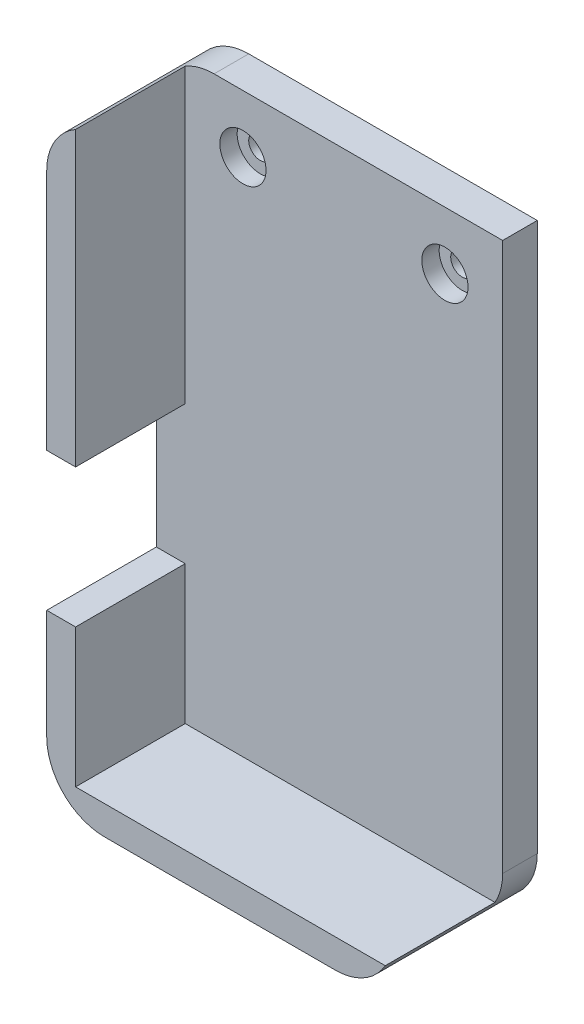
ISO-10303-21;
HEADER;
FILE_DESCRIPTION(('STEP AP214'),'2;1');
FILE_NAME('part.step','',(''),(''),'','','');
FILE_SCHEMA(('AUTOMOTIVE_DESIGN { 1 0 10303 214 1 1 1 1 }'));
ENDSEC;
DATA;
#1=APPLICATION_CONTEXT('core data for automotive mechanical design processes');
#2=APPLICATION_PROTOCOL_DEFINITION('international standard','automotive_design',2000,#1);
#3=PRODUCT_CONTEXT('',#1,'mechanical');
#4=PRODUCT('Part','Part','',(#3));
#5=PRODUCT_RELATED_PRODUCT_CATEGORY('part','',(#4));
#6=PRODUCT_DEFINITION_FORMATION('','',#4);
#7=PRODUCT_DEFINITION_CONTEXT('part definition',#1,'design');
#8=PRODUCT_DEFINITION('design','',#6,#7);
#9=PRODUCT_DEFINITION_SHAPE('','',#8);
#10=(LENGTH_UNIT() NAMED_UNIT(*) SI_UNIT(.MILLI.,.METRE.));
#11=(NAMED_UNIT(*) PLANE_ANGLE_UNIT() SI_UNIT($,.RADIAN.));
#12=(NAMED_UNIT(*) SI_UNIT($,.STERADIAN.) SOLID_ANGLE_UNIT());
#13=UNCERTAINTY_MEASURE_WITH_UNIT(LENGTH_MEASURE(1.E-05),#10,'distance_accuracy_value','');
#14=(GEOMETRIC_REPRESENTATION_CONTEXT(3) GLOBAL_UNCERTAINTY_ASSIGNED_CONTEXT((#13)) GLOBAL_UNIT_ASSIGNED_CONTEXT((#10,
#11,#12)) REPRESENTATION_CONTEXT('',''));
#15=CARTESIAN_POINT('',(0.,0.,0.));
#16=DIRECTION('',(0.,0.,1.));
#17=DIRECTION('',(1.,0.,0.));
#18=AXIS2_PLACEMENT_3D('',#15,#16,#17);
#19=CARTESIAN_POINT('',(5.,0.,25.));
#20=DIRECTION('',(1.,0.,0.));
#21=DIRECTION('',(0.,1.,0.));
#22=AXIS2_PLACEMENT_3D('',#19,#20,#21);
#23=PLANE('',#22);
#24=DIRECTION('',(0.,0.,1.));
#25=VECTOR('',#24,1.);
#26=CARTESIAN_POINT('',(4.99999999999999,53.,6.));
#27=LINE('',#26,#25);
#28=CARTESIAN_POINT('',(4.99999999999999,53.,6.));
#29=VERTEX_POINT('',#28);
#30=CARTESIAN_POINT('',(4.99999999999999,53.,25.));
#31=VERTEX_POINT('',#30);
#32=EDGE_CURVE('E162',#29,#31,#27,.T.);
#33=ORIENTED_EDGE('',*,*,#32,.F.);
#34=DIRECTION('',(0.,1.,0.));
#35=VECTOR('',#34,1.);
#36=CARTESIAN_POINT('',(5.,0.,6.));
#37=LINE('',#36,#35);
#38=CARTESIAN_POINT('',(4.99999999999999,103.660254037844,6.));
#39=VERTEX_POINT('',#38);
#40=EDGE_CURVE('E61',#29,#39,#37,.T.);
#41=ORIENTED_EDGE('',*,*,#40,.T.);
#42=DIRECTION('',(0.,0.,-1.));
#43=VECTOR('',#42,1.);
#44=CARTESIAN_POINT('',(4.99999999999999,103.660254037844,6.));
#45=LINE('',#44,#43);
#46=CARTESIAN_POINT('',(4.99999999999999,103.660254037844,25.));
#47=VERTEX_POINT('',#46);
#48=EDGE_CURVE('E11',#39,#47,#45,.F.);
#49=ORIENTED_EDGE('',*,*,#48,.T.);
#50=DIRECTION('',(0.,-1.,0.));
#51=VECTOR('',#50,1.);
#52=CARTESIAN_POINT('',(5.,0.,25.));
#53=LINE('',#52,#51);
#54=EDGE_CURVE('E190',#47,#31,#53,.T.);
#55=ORIENTED_EDGE('',*,*,#54,.T.);
#56=EDGE_LOOP('',(#33,#41,#49,#55));
#57=FACE_BOUND('',#56,.T.);
#58=ADVANCED_FACE('F39',(#57),#23,.T.);
#59=CARTESIAN_POINT('',(0.,0.,25.));
#60=DIRECTION('',(0.,0.,1.));
#61=DIRECTION('',(1.,0.,0.));
#62=AXIS2_PLACEMENT_3D('',#59,#60,#61);
#63=PLANE('',#62);
#64=DIRECTION('',(-1.,0.,0.));
#65=VECTOR('',#64,1.);
#66=CARTESIAN_POINT('',(0.,53.,25.));
#67=LINE('',#66,#65);
#68=CARTESIAN_POINT('',(0.,53.,25.));
#69=VERTEX_POINT('',#68);
#70=EDGE_CURVE('E155',#31,#69,#67,.T.);
#71=ORIENTED_EDGE('',*,*,#70,.F.);
#72=ORIENTED_EDGE('',*,*,#54,.F.);
#73=CARTESIAN_POINT('',(10.,95.,25.));
#74=DIRECTION('',(0.,0.,1.));
#75=DIRECTION('',(1.,0.,0.));
#76=AXIS2_PLACEMENT_3D('',#73,#74,#75);
#77=CIRCLE('',#76,10.);
#78=CARTESIAN_POINT('',(0.,95.,25.));
#79=VERTEX_POINT('',#78);
#80=EDGE_CURVE('E246',#47,#79,#77,.T.);
#81=ORIENTED_EDGE('',*,*,#80,.T.);
#82=DIRECTION('',(0.,1.,0.));
#83=VECTOR('',#82,1.);
#84=CARTESIAN_POINT('',(0.,0.,25.));
#85=LINE('',#84,#83);
#86=EDGE_CURVE('E193',#69,#79,#85,.T.);
#87=ORIENTED_EDGE('',*,*,#86,.F.);
#88=EDGE_LOOP('',(#71,#72,#81,#87));
#89=FACE_BOUND('',#88,.T.);
#90=ADVANCED_FACE('F277',(#89),#63,.T.);
#91=CARTESIAN_POINT('',(60.,0.,6.));
#92=DIRECTION('',(1.,0.,0.));
#93=DIRECTION('',(0.,1.,0.));
#94=AXIS2_PLACEMENT_3D('',#91,#92,#93);
#95=PLANE('',#94);
#96=DIRECTION('',(0.,-1.,0.));
#97=VECTOR('',#96,1.);
#98=CARTESIAN_POINT('',(60.,0.,6.));
#99=LINE('',#98,#97);
#100=CARTESIAN_POINT('',(60.,105.,6.));
#101=VERTEX_POINT('',#100);
#102=CARTESIAN_POINT('',(60.,10.,6.));
#103=VERTEX_POINT('',#102);
#104=EDGE_CURVE('E206',#101,#103,#99,.T.);
#105=ORIENTED_EDGE('',*,*,#104,.T.);
#106=DIRECTION('',(0.,0.,-1.));
#107=VECTOR('',#106,1.);
#108=CARTESIAN_POINT('',(60.,10.,0.));
#109=LINE('',#108,#107);
#110=CARTESIAN_POINT('',(60.,10.,0.));
#111=VERTEX_POINT('',#110);
#112=EDGE_CURVE('E230',#103,#111,#109,.T.);
#113=ORIENTED_EDGE('',*,*,#112,.T.);
#114=DIRECTION('',(0.,-1.,0.));
#115=VECTOR('',#114,1.);
#116=CARTESIAN_POINT('',(60.,0.,0.));
#117=LINE('',#116,#115);
#118=CARTESIAN_POINT('',(60.,105.,0.));
#119=VERTEX_POINT('',#118);
#120=EDGE_CURVE('E205',#119,#111,#117,.T.);
#121=ORIENTED_EDGE('',*,*,#120,.F.);
#122=DIRECTION('',(0.,0.,-1.));
#123=VECTOR('',#122,1.);
#124=CARTESIAN_POINT('',(60.,105.,6.));
#125=LINE('',#124,#123);
#126=EDGE_CURVE('E212',#101,#119,#125,.T.);
#127=ORIENTED_EDGE('',*,*,#126,.F.);
#128=EDGE_LOOP('',(#105,#113,#121,#127));
#129=FACE_BOUND('',#128,.T.);
#130=ADVANCED_FACE('F326',(#129),#95,.T.);
#131=CARTESIAN_POINT('',(0.,105.,6.));
#132=DIRECTION('',(0.,1.,0.));
#133=DIRECTION('',(0.,0.,1.));
#134=AXIS2_PLACEMENT_3D('',#131,#132,#133);
#135=PLANE('',#134);
#136=DIRECTION('',(1.,0.,0.));
#137=VECTOR('',#136,1.);
#138=CARTESIAN_POINT('',(0.,105.,0.));
#139=LINE('',#138,#137);
#140=CARTESIAN_POINT('',(10.,105.,0.));
#141=VERTEX_POINT('',#140);
#142=EDGE_CURVE('E215',#141,#119,#139,.T.);
#143=ORIENTED_EDGE('',*,*,#142,.F.);
#144=DIRECTION('',(0.,0.,-1.));
#145=VECTOR('',#144,1.);
#146=CARTESIAN_POINT('',(10.,105.,6.));
#147=LINE('',#146,#145);
#148=CARTESIAN_POINT('',(10.,105.,6.));
#149=VERTEX_POINT('',#148);
#150=EDGE_CURVE('E47',#141,#149,#147,.F.);
#151=ORIENTED_EDGE('',*,*,#150,.T.);
#152=DIRECTION('',(1.,0.,0.));
#153=VECTOR('',#152,1.);
#154=CARTESIAN_POINT('',(0.,105.,6.));
#155=LINE('',#154,#153);
#156=EDGE_CURVE('E209',#149,#101,#155,.T.);
#157=ORIENTED_EDGE('',*,*,#156,.T.);
#158=ORIENTED_EDGE('',*,*,#126,.T.);
#159=EDGE_LOOP('',(#143,#151,#157,#158));
#160=FACE_BOUND('',#159,.T.);
#161=ADVANCED_FACE('F265',(#160),#135,.T.);
#162=CARTESIAN_POINT('',(0.,0.,6.));
#163=DIRECTION('',(-1.,0.,0.));
#164=DIRECTION('',(0.,0.,1.));
#165=AXIS2_PLACEMENT_3D('',#162,#163,#164);
#166=PLANE('',#165);
#167=DIRECTION('',(0.,0.,1.));
#168=VECTOR('',#167,1.);
#169=CARTESIAN_POINT('',(0.,53.,6.));
#170=LINE('',#169,#168);
#171=CARTESIAN_POINT('',(0.,53.,6.));
#172=VERTEX_POINT('',#171);
#173=EDGE_CURVE('E174',#172,#69,#170,.T.);
#174=ORIENTED_EDGE('',*,*,#173,.T.);
#175=ORIENTED_EDGE('',*,*,#86,.T.);
#176=DIRECTION('',(0.,0.,-1.));
#177=VECTOR('',#176,1.);
#178=CARTESIAN_POINT('',(0.,95.,6.));
#179=LINE('',#178,#177);
#180=CARTESIAN_POINT('',(0.,95.,0.));
#181=VERTEX_POINT('',#180);
#182=EDGE_CURVE('E259',#79,#181,#179,.T.);
#183=ORIENTED_EDGE('',*,*,#182,.T.);
#184=DIRECTION('',(0.,1.,0.));
#185=VECTOR('',#184,1.);
#186=CARTESIAN_POINT('',(0.,0.,0.));
#187=LINE('',#186,#185);
#188=CARTESIAN_POINT('',(0.,10.,0.));
#189=VERTEX_POINT('',#188);
#190=EDGE_CURVE('E217',#189,#181,#187,.T.);
#191=ORIENTED_EDGE('',*,*,#190,.F.);
#192=DIRECTION('',(0.,0.,-1.));
#193=VECTOR('',#192,1.);
#194=CARTESIAN_POINT('',(0.,10.,25.));
#195=LINE('',#194,#193);
#196=CARTESIAN_POINT('',(0.,10.,25.));
#197=VERTEX_POINT('',#196);
#198=EDGE_CURVE('E257',#189,#197,#195,.F.);
#199=ORIENTED_EDGE('',*,*,#198,.T.);
#200=CARTESIAN_POINT('',(0.,29.,25.));
#201=VERTEX_POINT('',#200);
#202=EDGE_CURVE('E160',#197,#201,#85,.T.);
#203=ORIENTED_EDGE('',*,*,#202,.T.);
#204=DIRECTION('',(0.,0.,1.));
#205=VECTOR('',#204,1.);
#206=CARTESIAN_POINT('',(0.,29.,6.));
#207=LINE('',#206,#205);
#208=CARTESIAN_POINT('',(0.,29.,6.));
#209=VERTEX_POINT('',#208);
#210=EDGE_CURVE('E54',#209,#201,#207,.T.);
#211=ORIENTED_EDGE('',*,*,#210,.F.);
#212=DIRECTION('',(0.,-1.,0.));
#213=VECTOR('',#212,1.);
#214=CARTESIAN_POINT('',(0.,29.,6.));
#215=LINE('',#214,#213);
#216=EDGE_CURVE('E147',#172,#209,#215,.T.);
#217=ORIENTED_EDGE('',*,*,#216,.F.);
#218=EDGE_LOOP('',(#174,#175,#183,#191,#199,#203,#211,#217));
#219=FACE_BOUND('',#218,.T.);
#220=ADVANCED_FACE('F158',(#219),#166,.T.);
#221=CARTESIAN_POINT('',(0.,0.,6.));
#222=DIRECTION('',(0.,1.,0.));
#223=DIRECTION('',(0.,0.,1.));
#224=AXIS2_PLACEMENT_3D('',#221,#222,#223);
#225=PLANE('',#224);
#226=DIRECTION('',(1.,0.,0.));
#227=VECTOR('',#226,1.);
#228=CARTESIAN_POINT('',(0.,0.,0.));
#229=LINE('',#228,#227);
#230=CARTESIAN_POINT('',(10.,0.,0.));
#231=VERTEX_POINT('',#230);
#232=CARTESIAN_POINT('',(50.,0.,0.));
#233=VERTEX_POINT('',#232);
#234=EDGE_CURVE('E210',#231,#233,#229,.T.);
#235=ORIENTED_EDGE('',*,*,#234,.T.);
#236=DIRECTION('',(0.,0.,-1.));
#237=VECTOR('',#236,1.);
#238=CARTESIAN_POINT('',(50.,0.,25.));
#239=LINE('',#238,#237);
#240=CARTESIAN_POINT('',(50.,0.,25.));
#241=VERTEX_POINT('',#240);
#242=EDGE_CURVE('E242',#233,#241,#239,.F.);
#243=ORIENTED_EDGE('',*,*,#242,.T.);
#244=DIRECTION('',(1.,0.,0.));
#245=VECTOR('',#244,1.);
#246=CARTESIAN_POINT('',(0.,0.,25.));
#247=LINE('',#246,#245);
#248=CARTESIAN_POINT('',(10.,0.,25.));
#249=VERTEX_POINT('',#248);
#250=EDGE_CURVE('E195',#249,#241,#247,.T.);
#251=ORIENTED_EDGE('',*,*,#250,.F.);
#252=DIRECTION('',(0.,0.,-1.));
#253=VECTOR('',#252,1.);
#254=CARTESIAN_POINT('',(10.,0.,0.));
#255=LINE('',#254,#253);
#256=EDGE_CURVE('E239',#249,#231,#255,.T.);
#257=ORIENTED_EDGE('',*,*,#256,.T.);
#258=EDGE_LOOP('',(#235,#243,#251,#257));
#259=FACE_BOUND('',#258,.T.);
#260=ADVANCED_FACE('F296',(#259),#225,.F.);
#261=CARTESIAN_POINT('',(0.,0.,6.));
#262=DIRECTION('',(0.,0.,1.));
#263=DIRECTION('',(1.,0.,0.));
#264=AXIS2_PLACEMENT_3D('',#261,#262,#263);
#265=PLANE('',#264);
#266=CARTESIAN_POINT('',(50.,95.,6.));
#267=DIRECTION('',(0.,0.,1.));
#268=DIRECTION('',(1.,0.,0.));
#269=AXIS2_PLACEMENT_3D('',#266,#267,#268);
#270=CIRCLE('',#269,4.00000000000001);
#271=CARTESIAN_POINT('',(54.,95.,6.));
#272=VERTEX_POINT('',#271);
#273=EDGE_CURVE('E183',#272,#272,#270,.F.);
#274=ORIENTED_EDGE('',*,*,#273,.T.);
#275=EDGE_LOOP('',(#274));
#276=FACE_BOUND('',#275,.T.);
#277=CARTESIAN_POINT('',(15.,95.,6.));
#278=DIRECTION('',(0.,0.,1.));
#279=DIRECTION('',(1.,0.,0.));
#280=AXIS2_PLACEMENT_3D('',#277,#278,#279);
#281=CIRCLE('',#280,3.99999999999999);
#282=CARTESIAN_POINT('',(19.,95.,6.));
#283=VERTEX_POINT('',#282);
#284=EDGE_CURVE('E178',#283,#283,#281,.F.);
#285=ORIENTED_EDGE('',*,*,#284,.T.);
#286=EDGE_LOOP('',(#285));
#287=FACE_BOUND('',#286,.T.);
#288=DIRECTION('',(-1.,0.,0.));
#289=VECTOR('',#288,1.);
#290=CARTESIAN_POINT('',(0.,5.,6.));
#291=LINE('',#290,#289);
#292=CARTESIAN_POINT('',(58.6602540378444,5.,6.));
#293=VERTEX_POINT('',#292);
#294=CARTESIAN_POINT('',(5.,5.,6.));
#295=VERTEX_POINT('',#294);
#296=EDGE_CURVE('E203',#293,#295,#291,.T.);
#297=ORIENTED_EDGE('',*,*,#296,.F.);
#298=CARTESIAN_POINT('',(50.,10.,6.));
#299=DIRECTION('',(0.,0.,1.));
#300=DIRECTION('',(1.,0.,0.));
#301=AXIS2_PLACEMENT_3D('',#298,#299,#300);
#302=CIRCLE('',#301,10.);
#303=EDGE_CURVE('E255',#293,#103,#302,.T.);
#304=ORIENTED_EDGE('',*,*,#303,.T.);
#305=ORIENTED_EDGE('',*,*,#104,.F.);
#306=ORIENTED_EDGE('',*,*,#156,.F.);
#307=CARTESIAN_POINT('',(10.,95.,6.));
#308=DIRECTION('',(0.,0.,1.));
#309=DIRECTION('',(1.,0.,0.));
#310=AXIS2_PLACEMENT_3D('',#307,#308,#309);
#311=CIRCLE('',#310,10.);
#312=EDGE_CURVE('E253',#149,#39,#311,.T.);
#313=ORIENTED_EDGE('',*,*,#312,.T.);
#314=ORIENTED_EDGE('',*,*,#40,.F.);
#315=DIRECTION('',(-1.,0.,0.));
#316=VECTOR('',#315,1.);
#317=CARTESIAN_POINT('',(0.,53.,6.));
#318=LINE('',#317,#316);
#319=EDGE_CURVE('E146',#29,#172,#318,.T.);
#320=ORIENTED_EDGE('',*,*,#319,.T.);
#321=ORIENTED_EDGE('',*,*,#216,.T.);
#322=DIRECTION('',(1.,0.,0.));
#323=VECTOR('',#322,1.);
#324=CARTESIAN_POINT('',(0.,29.,6.));
#325=LINE('',#324,#323);
#326=CARTESIAN_POINT('',(4.99999999999999,29.,6.));
#327=VERTEX_POINT('',#326);
#328=EDGE_CURVE('E138',#209,#327,#325,.T.);
#329=ORIENTED_EDGE('',*,*,#328,.T.);
#330=EDGE_CURVE('E201',#295,#327,#37,.T.);
#331=ORIENTED_EDGE('',*,*,#330,.F.);
#332=EDGE_LOOP('',(#297,#304,#305,#306,#313,#314,#320,#321,#329,#331));
#333=FACE_BOUND('',#332,.T.);
#334=ADVANCED_FACE('F152',(#276,#287,#333),#265,.T.);
#335=CARTESIAN_POINT('',(0.,0.,0.));
#336=DIRECTION('',(0.,0.,1.));
#337=DIRECTION('',(1.,0.,0.));
#338=AXIS2_PLACEMENT_3D('',#335,#336,#337);
#339=PLANE('',#338);
#340=ORIENTED_EDGE('',*,*,#120,.T.);
#341=CARTESIAN_POINT('',(50.,10.,0.));
#342=DIRECTION('',(0.,0.,1.));
#343=DIRECTION('',(1.,0.,0.));
#344=AXIS2_PLACEMENT_3D('',#341,#342,#343);
#345=CIRCLE('',#344,10.);
#346=EDGE_CURVE('E237',#111,#233,#345,.F.);
#347=ORIENTED_EDGE('',*,*,#346,.T.);
#348=ORIENTED_EDGE('',*,*,#234,.F.);
#349=CARTESIAN_POINT('',(10.,10.,0.));
#350=DIRECTION('',(0.,0.,1.));
#351=DIRECTION('',(1.,0.,0.));
#352=AXIS2_PLACEMENT_3D('',#349,#350,#351);
#353=CIRCLE('',#352,10.);
#354=EDGE_CURVE('E233',#231,#189,#353,.F.);
#355=ORIENTED_EDGE('',*,*,#354,.T.);
#356=ORIENTED_EDGE('',*,*,#190,.T.);
#357=CARTESIAN_POINT('',(10.,95.,0.));
#358=DIRECTION('',(0.,0.,1.));
#359=DIRECTION('',(1.,0.,0.));
#360=AXIS2_PLACEMENT_3D('',#357,#358,#359);
#361=CIRCLE('',#360,10.);
#362=EDGE_CURVE('E235',#181,#141,#361,.F.);
#363=ORIENTED_EDGE('',*,*,#362,.T.);
#364=ORIENTED_EDGE('',*,*,#142,.T.);
#365=EDGE_LOOP('',(#340,#347,#348,#355,#356,#363,#364));
#366=FACE_BOUND('',#365,.T.);
#367=CARTESIAN_POINT('',(50.,95.,0.));
#368=DIRECTION('',(0.,0.,1.));
#369=DIRECTION('',(1.,0.,0.));
#370=AXIS2_PLACEMENT_3D('',#367,#368,#369);
#371=CIRCLE('',#370,2.);
#372=CARTESIAN_POINT('',(52.,95.,0.));
#373=VERTEX_POINT('',#372);
#374=EDGE_CURVE('E170',#373,#373,#371,.T.);
#375=ORIENTED_EDGE('',*,*,#374,.T.);
#376=EDGE_LOOP('',(#375));
#377=FACE_BOUND('',#376,.T.);
#378=CARTESIAN_POINT('',(15.,95.,0.));
#379=DIRECTION('',(0.,0.,1.));
#380=DIRECTION('',(1.,0.,0.));
#381=AXIS2_PLACEMENT_3D('',#378,#379,#380);
#382=CIRCLE('',#381,2.00000000000001);
#383=CARTESIAN_POINT('',(17.,95.,0.));
#384=VERTEX_POINT('',#383);
#385=EDGE_CURVE('E171',#384,#384,#382,.T.);
#386=ORIENTED_EDGE('',*,*,#385,.T.);
#387=EDGE_LOOP('',(#386));
#388=FACE_BOUND('',#387,.T.);
#389=ADVANCED_FACE('F288',(#366,#377,#388),#339,.F.);
#390=CARTESIAN_POINT('',(0.,5.,25.));
#391=DIRECTION('',(0.,1.,0.));
#392=DIRECTION('',(0.,0.,1.));
#393=AXIS2_PLACEMENT_3D('',#390,#391,#392);
#394=PLANE('',#393);
#395=DIRECTION('',(1.,0.,0.));
#396=VECTOR('',#395,1.);
#397=CARTESIAN_POINT('',(0.,5.,25.));
#398=LINE('',#397,#396);
#399=CARTESIAN_POINT('',(5.,5.,25.));
#400=VERTEX_POINT('',#399);
#401=CARTESIAN_POINT('',(58.6602540378444,5.,25.));
#402=VERTEX_POINT('',#401);
#403=EDGE_CURVE('E186',#400,#402,#398,.T.);
#404=ORIENTED_EDGE('',*,*,#403,.T.);
#405=DIRECTION('',(0.,0.,1.));
#406=VECTOR('',#405,1.);
#407=CARTESIAN_POINT('',(58.6602540378444,5.,25.));
#408=LINE('',#407,#406);
#409=EDGE_CURVE('E251',#402,#293,#408,.F.);
#410=ORIENTED_EDGE('',*,*,#409,.T.);
#411=ORIENTED_EDGE('',*,*,#296,.T.);
#412=DIRECTION('',(0.,0.,-1.));
#413=VECTOR('',#412,1.);
#414=CARTESIAN_POINT('',(5.,5.,25.));
#415=LINE('',#414,#413);
#416=EDGE_CURVE('E198',#400,#295,#415,.T.);
#417=ORIENTED_EDGE('',*,*,#416,.F.);
#418=EDGE_LOOP('',(#404,#410,#411,#417));
#419=FACE_BOUND('',#418,.T.);
#420=ADVANCED_FACE('F308',(#419),#394,.T.);
#421=DIRECTION('',(0.,0.,1.));
#422=VECTOR('',#421,1.);
#423=CARTESIAN_POINT('',(4.99999999999999,29.,6.));
#424=LINE('',#423,#422);
#425=CARTESIAN_POINT('',(4.99999999999999,29.,25.));
#426=VERTEX_POINT('',#425);
#427=EDGE_CURVE('E142',#327,#426,#424,.T.);
#428=ORIENTED_EDGE('',*,*,#427,.T.);
#429=EDGE_CURVE('E189',#426,#400,#53,.T.);
#430=ORIENTED_EDGE('',*,*,#429,.T.);
#431=ORIENTED_EDGE('',*,*,#416,.T.);
#432=ORIENTED_EDGE('',*,*,#330,.T.);
#433=EDGE_LOOP('',(#428,#430,#431,#432));
#434=FACE_BOUND('',#433,.T.);
#435=ADVANCED_FACE('F311',(#434),#23,.T.);
#436=DIRECTION('',(1.,0.,0.));
#437=VECTOR('',#436,1.);
#438=CARTESIAN_POINT('',(0.,29.,25.));
#439=LINE('',#438,#437);
#440=EDGE_CURVE('E280',#201,#426,#439,.T.);
#441=ORIENTED_EDGE('',*,*,#440,.F.);
#442=ORIENTED_EDGE('',*,*,#202,.F.);
#443=CARTESIAN_POINT('',(10.,10.,25.));
#444=DIRECTION('',(0.,0.,1.));
#445=DIRECTION('',(1.,0.,0.));
#446=AXIS2_PLACEMENT_3D('',#443,#444,#445);
#447=CIRCLE('',#446,10.);
#448=EDGE_CURVE('E244',#197,#249,#447,.T.);
#449=ORIENTED_EDGE('',*,*,#448,.T.);
#450=ORIENTED_EDGE('',*,*,#250,.T.);
#451=CARTESIAN_POINT('',(50.,10.,25.));
#452=DIRECTION('',(0.,0.,1.));
#453=DIRECTION('',(1.,0.,0.));
#454=AXIS2_PLACEMENT_3D('',#451,#452,#453);
#455=CIRCLE('',#454,10.);
#456=EDGE_CURVE('E249',#241,#402,#455,.T.);
#457=ORIENTED_EDGE('',*,*,#456,.T.);
#458=ORIENTED_EDGE('',*,*,#403,.F.);
#459=ORIENTED_EDGE('',*,*,#429,.F.);
#460=EDGE_LOOP('',(#441,#442,#449,#450,#457,#458,#459));
#461=FACE_BOUND('',#460,.T.);
#462=ADVANCED_FACE('F300',(#461),#63,.T.);
#463=CARTESIAN_POINT('',(15.,95.,25.));
#464=DIRECTION('',(0.,0.,-1.));
#465=DIRECTION('',(-1.,0.,0.));
#466=AXIS2_PLACEMENT_3D('',#463,#464,#465);
#467=CYLINDRICAL_SURFACE('',#466,3.99999999999999);
#468=CARTESIAN_POINT('',(15.,95.,3.));
#469=DIRECTION('',(0.,0.,1.));
#470=DIRECTION('',(1.,0.,0.));
#471=AXIS2_PLACEMENT_3D('',#468,#469,#470);
#472=CIRCLE('',#471,3.99999999999999);
#473=CARTESIAN_POINT('',(19.,95.,3.));
#474=VERTEX_POINT('',#473);
#475=EDGE_CURVE('E227',#474,#474,#472,.T.);
#476=ORIENTED_EDGE('',*,*,#475,.F.);
#477=EDGE_LOOP('',(#476));
#478=FACE_BOUND('',#477,.T.);
#479=ORIENTED_EDGE('',*,*,#284,.F.);
#480=EDGE_LOOP('',(#479));
#481=FACE_BOUND('',#480,.T.);
#482=ADVANCED_FACE('F319',(#478,#481),#467,.F.);
#483=CARTESIAN_POINT('',(50.,95.,25.));
#484=DIRECTION('',(0.,0.,-1.));
#485=DIRECTION('',(-1.,0.,0.));
#486=AXIS2_PLACEMENT_3D('',#483,#484,#485);
#487=CYLINDRICAL_SURFACE('',#486,4.00000000000001);
#488=CARTESIAN_POINT('',(50.,95.,3.));
#489=DIRECTION('',(0.,0.,1.));
#490=DIRECTION('',(1.,0.,0.));
#491=AXIS2_PLACEMENT_3D('',#488,#489,#490);
#492=CIRCLE('',#491,4.00000000000001);
#493=CARTESIAN_POINT('',(54.,95.,3.));
#494=VERTEX_POINT('',#493);
#495=EDGE_CURVE('E224',#494,#494,#492,.T.);
#496=ORIENTED_EDGE('',*,*,#495,.F.);
#497=EDGE_LOOP('',(#496));
#498=FACE_BOUND('',#497,.T.);
#499=ORIENTED_EDGE('',*,*,#273,.F.);
#500=EDGE_LOOP('',(#499));
#501=FACE_BOUND('',#500,.T.);
#502=ADVANCED_FACE('F335',(#498,#501),#487,.F.);
#503=CARTESIAN_POINT('',(50.,95.,3.));
#504=DIRECTION('',(0.,0.,-1.));
#505=DIRECTION('',(-1.,0.,0.));
#506=AXIS2_PLACEMENT_3D('',#503,#504,#505);
#507=CYLINDRICAL_SURFACE('',#506,2.);
#508=CARTESIAN_POINT('',(50.,95.,3.));
#509=DIRECTION('',(0.,0.,1.));
#510=DIRECTION('',(1.,0.,0.));
#511=AXIS2_PLACEMENT_3D('',#508,#509,#510);
#512=CIRCLE('',#511,2.);
#513=CARTESIAN_POINT('',(52.,95.,3.));
#514=VERTEX_POINT('',#513);
#515=EDGE_CURVE('E175',#514,#514,#512,.T.);
#516=ORIENTED_EDGE('',*,*,#515,.T.);
#517=EDGE_LOOP('',(#516));
#518=FACE_BOUND('',#517,.T.);
#519=ORIENTED_EDGE('',*,*,#374,.F.);
#520=EDGE_LOOP('',(#519));
#521=FACE_BOUND('',#520,.T.);
#522=ADVANCED_FACE('F339',(#518,#521),#507,.F.);
#523=CARTESIAN_POINT('',(0.,0.,3.));
#524=DIRECTION('',(0.,0.,1.));
#525=DIRECTION('',(1.,0.,0.));
#526=AXIS2_PLACEMENT_3D('',#523,#524,#525);
#527=PLANE('',#526);
#528=ORIENTED_EDGE('',*,*,#515,.F.);
#529=EDGE_LOOP('',(#528));
#530=FACE_BOUND('',#529,.T.);
#531=ORIENTED_EDGE('',*,*,#495,.T.);
#532=EDGE_LOOP('',(#531));
#533=FACE_BOUND('',#532,.T.);
#534=ADVANCED_FACE('F343',(#530,#533),#527,.T.);
#535=CARTESIAN_POINT('',(15.,95.,3.));
#536=DIRECTION('',(0.,0.,-1.));
#537=DIRECTION('',(-1.,0.,0.));
#538=AXIS2_PLACEMENT_3D('',#535,#536,#537);
#539=CYLINDRICAL_SURFACE('',#538,2.00000000000001);
#540=CARTESIAN_POINT('',(15.,95.,3.));
#541=DIRECTION('',(0.,0.,1.));
#542=DIRECTION('',(1.,0.,0.));
#543=AXIS2_PLACEMENT_3D('',#540,#541,#542);
#544=CIRCLE('',#543,2.00000000000001);
#545=CARTESIAN_POINT('',(17.,95.,3.));
#546=VERTEX_POINT('',#545);
#547=EDGE_CURVE('E167',#546,#546,#544,.T.);
#548=ORIENTED_EDGE('',*,*,#547,.T.);
#549=EDGE_LOOP('',(#548));
#550=FACE_BOUND('',#549,.T.);
#551=ORIENTED_EDGE('',*,*,#385,.F.);
#552=EDGE_LOOP('',(#551));
#553=FACE_BOUND('',#552,.T.);
#554=ADVANCED_FACE('F347',(#550,#553),#539,.F.);
#555=CARTESIAN_POINT('',(0.,0.,3.));
#556=DIRECTION('',(0.,0.,1.));
#557=DIRECTION('',(1.,0.,0.));
#558=AXIS2_PLACEMENT_3D('',#555,#556,#557);
#559=PLANE('',#558);
#560=ORIENTED_EDGE('',*,*,#547,.F.);
#561=EDGE_LOOP('',(#560));
#562=FACE_BOUND('',#561,.T.);
#563=ORIENTED_EDGE('',*,*,#475,.T.);
#564=EDGE_LOOP('',(#563));
#565=FACE_BOUND('',#564,.T.);
#566=ADVANCED_FACE('F351',(#562,#565),#559,.T.);
#567=CARTESIAN_POINT('',(50.,10.,6.));
#568=DIRECTION('',(0.,0.,1.));
#569=DIRECTION('',(1.,0.,0.));
#570=AXIS2_PLACEMENT_3D('',#567,#568,#569);
#571=CYLINDRICAL_SURFACE('',#570,10.);
#572=ORIENTED_EDGE('',*,*,#456,.F.);
#573=ORIENTED_EDGE('',*,*,#242,.F.);
#574=ORIENTED_EDGE('',*,*,#346,.F.);
#575=ORIENTED_EDGE('',*,*,#112,.F.);
#576=ORIENTED_EDGE('',*,*,#303,.F.);
#577=ORIENTED_EDGE('',*,*,#409,.F.);
#578=EDGE_LOOP('',(#572,#573,#574,#575,#576,#577));
#579=FACE_BOUND('',#578,.T.);
#580=ADVANCED_FACE('F304',(#579),#571,.T.);
#581=CARTESIAN_POINT('',(10.,95.,6.));
#582=DIRECTION('',(0.,0.,-1.));
#583=DIRECTION('',(-1.,0.,0.));
#584=AXIS2_PLACEMENT_3D('',#581,#582,#583);
#585=CYLINDRICAL_SURFACE('',#584,10.);
#586=ORIENTED_EDGE('',*,*,#312,.F.);
#587=ORIENTED_EDGE('',*,*,#150,.F.);
#588=ORIENTED_EDGE('',*,*,#362,.F.);
#589=ORIENTED_EDGE('',*,*,#182,.F.);
#590=ORIENTED_EDGE('',*,*,#80,.F.);
#591=ORIENTED_EDGE('',*,*,#48,.F.);
#592=EDGE_LOOP('',(#586,#587,#588,#589,#590,#591));
#593=FACE_BOUND('',#592,.T.);
#594=ADVANCED_FACE('F271',(#593),#585,.T.);
#595=CARTESIAN_POINT('',(10.,10.,6.));
#596=DIRECTION('',(0.,0.,1.));
#597=DIRECTION('',(1.,0.,0.));
#598=AXIS2_PLACEMENT_3D('',#595,#596,#597);
#599=CYLINDRICAL_SURFACE('',#598,10.);
#600=ORIENTED_EDGE('',*,*,#448,.F.);
#601=ORIENTED_EDGE('',*,*,#198,.F.);
#602=ORIENTED_EDGE('',*,*,#354,.F.);
#603=ORIENTED_EDGE('',*,*,#256,.F.);
#604=EDGE_LOOP('',(#600,#601,#602,#603));
#605=FACE_BOUND('',#604,.T.);
#606=ADVANCED_FACE('F41',(#605),#599,.T.);
#607=CARTESIAN_POINT('',(0.,53.,6.));
#608=DIRECTION('',(0.,1.,0.));
#609=DIRECTION('',(0.,0.,1.));
#610=AXIS2_PLACEMENT_3D('',#607,#608,#609);
#611=PLANE('',#610);
#612=ORIENTED_EDGE('',*,*,#70,.T.);
#613=ORIENTED_EDGE('',*,*,#173,.F.);
#614=ORIENTED_EDGE('',*,*,#319,.F.);
#615=ORIENTED_EDGE('',*,*,#32,.T.);
#616=EDGE_LOOP('',(#612,#613,#614,#615));
#617=FACE_BOUND('',#616,.T.);
#618=ADVANCED_FACE('F284',(#617),#611,.F.);
#619=CARTESIAN_POINT('',(0.,29.,6.));
#620=DIRECTION('',(0.,-1.,0.));
#621=DIRECTION('',(1.,0.,0.));
#622=AXIS2_PLACEMENT_3D('',#619,#620,#621);
#623=PLANE('',#622);
#624=ORIENTED_EDGE('',*,*,#440,.T.);
#625=ORIENTED_EDGE('',*,*,#427,.F.);
#626=ORIENTED_EDGE('',*,*,#328,.F.);
#627=ORIENTED_EDGE('',*,*,#210,.T.);
#628=EDGE_LOOP('',(#624,#625,#626,#627));
#629=FACE_BOUND('',#628,.T.);
#630=ADVANCED_FACE('F140',(#629),#623,.F.);
#631=CLOSED_SHELL('',(#58,#90,#130,#161,#220,#260,#334,#389,#420,#435,#462,#482,#502,#522,#534,
#554,#566,#580,#594,#606,#618,#630));
#632=MANIFOLD_SOLID_BREP('B2',#631);
#633=ADVANCED_BREP_SHAPE_REPRESENTATION('',(#18,#632),#14);
#634=SHAPE_DEFINITION_REPRESENTATION(#9,#633);
ENDSEC;
END-ISO-10303-21;
